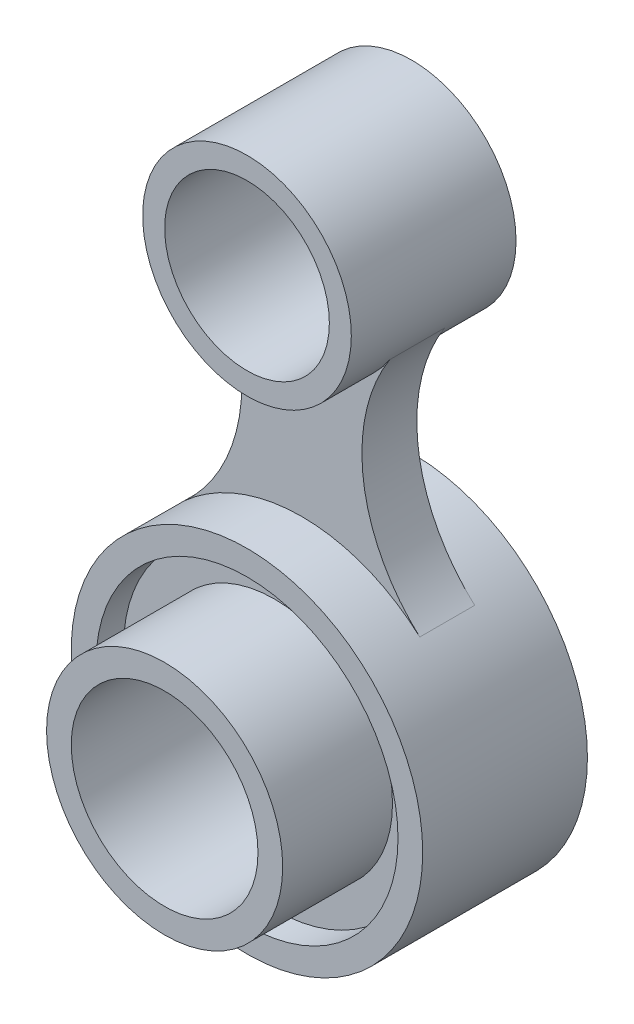
ISO-10303-21;
HEADER;
FILE_DESCRIPTION(('STEP AP214'),'2;1');
FILE_NAME('part.step','',(''),(''),'','','');
FILE_SCHEMA(('AUTOMOTIVE_DESIGN { 1 0 10303 214 1 1 1 1 }'));
ENDSEC;
DATA;
#1=APPLICATION_CONTEXT('core data for automotive mechanical design processes');
#2=APPLICATION_PROTOCOL_DEFINITION('international standard','automotive_design',2000,#1);
#3=PRODUCT_CONTEXT('',#1,'mechanical');
#4=PRODUCT('Part','Part','',(#3));
#5=PRODUCT_RELATED_PRODUCT_CATEGORY('part','',(#4));
#6=PRODUCT_DEFINITION_FORMATION('','',#4);
#7=PRODUCT_DEFINITION_CONTEXT('part definition',#1,'design');
#8=PRODUCT_DEFINITION('design','',#6,#7);
#9=PRODUCT_DEFINITION_SHAPE('','',#8);
#10=(LENGTH_UNIT() NAMED_UNIT(*) SI_UNIT(.MILLI.,.METRE.));
#11=(NAMED_UNIT(*) PLANE_ANGLE_UNIT() SI_UNIT($,.RADIAN.));
#12=(NAMED_UNIT(*) SI_UNIT($,.STERADIAN.) SOLID_ANGLE_UNIT());
#13=UNCERTAINTY_MEASURE_WITH_UNIT(LENGTH_MEASURE(1.E-05),#10,'distance_accuracy_value','');
#14=(GEOMETRIC_REPRESENTATION_CONTEXT(3) GLOBAL_UNCERTAINTY_ASSIGNED_CONTEXT((#13)) GLOBAL_UNIT_ASSIGNED_CONTEXT((#10,
#11,#12)) REPRESENTATION_CONTEXT('',''));
#15=CARTESIAN_POINT('',(0.,0.,0.));
#16=DIRECTION('',(0.,0.,1.));
#17=DIRECTION('',(1.,0.,0.));
#18=AXIS2_PLACEMENT_3D('',#15,#16,#17);
#19=CARTESIAN_POINT('',(0.,0.,45.));
#20=DIRECTION('',(0.,0.,-1.));
#21=DIRECTION('',(-1.,0.,0.));
#22=AXIS2_PLACEMENT_3D('',#19,#20,#21);
#23=CYLINDRICAL_SURFACE('',#22,32.);
#24=DIRECTION('',(0.,0.,-1.));
#25=VECTOR('',#24,1.);
#26=CARTESIAN_POINT('',(21.4645961734408,23.7333333333333,20.));
#27=LINE('',#26,#25);
#28=CARTESIAN_POINT('',(21.4645961734408,23.7333333333333,20.));
#29=VERTEX_POINT('',#28);
#30=CARTESIAN_POINT('',(21.4645961734408,23.7333333333333,10.));
#31=VERTEX_POINT('',#30);
#32=EDGE_CURVE('E51',#29,#31,#27,.T.);
#33=ORIENTED_EDGE('',*,*,#32,.F.);
#34=CARTESIAN_POINT('',(0.,0.,20.));
#35=DIRECTION('',(0.,0.,-1.));
#36=DIRECTION('',(1.,0.,0.));
#37=AXIS2_PLACEMENT_3D('',#34,#35,#36);
#38=CIRCLE('',#37,32.);
#39=CARTESIAN_POINT('',(-21.4645961734408,23.7333333333333,20.));
#40=VERTEX_POINT('',#39);
#41=EDGE_CURVE('E56',#40,#29,#38,.T.);
#42=ORIENTED_EDGE('',*,*,#41,.F.);
#43=DIRECTION('',(0.,0.,-1.));
#44=VECTOR('',#43,1.);
#45=CARTESIAN_POINT('',(-21.4645961734408,23.7333333333333,20.));
#46=LINE('',#45,#44);
#47=CARTESIAN_POINT('',(-21.4645961734408,23.7333333333333,10.));
#48=VERTEX_POINT('',#47);
#49=EDGE_CURVE('E96',#40,#48,#46,.T.);
#50=ORIENTED_EDGE('',*,*,#49,.T.);
#51=CARTESIAN_POINT('',(0.,0.,10.));
#52=DIRECTION('',(0.,0.,-1.));
#53=DIRECTION('',(1.,0.,0.));
#54=AXIS2_PLACEMENT_3D('',#51,#52,#53);
#55=CIRCLE('',#54,32.);
#56=EDGE_CURVE('E84',#48,#31,#55,.T.);
#57=ORIENTED_EDGE('',*,*,#56,.T.);
#58=EDGE_LOOP('',(#33,#42,#50,#57));
#59=FACE_BOUND('',#58,.T.);
#60=CARTESIAN_POINT('',(0.,0.,0.));
#61=DIRECTION('',(0.,0.,1.));
#62=DIRECTION('',(1.,0.,0.));
#63=AXIS2_PLACEMENT_3D('',#60,#61,#62);
#64=CIRCLE('',#63,32.);
#65=CARTESIAN_POINT('',(32.,0.,0.));
#66=VERTEX_POINT('',#65);
#67=EDGE_CURVE('E11',#66,#66,#64,.T.);
#68=ORIENTED_EDGE('',*,*,#67,.T.);
#69=EDGE_LOOP('',(#68));
#70=FACE_BOUND('',#69,.T.);
#71=CARTESIAN_POINT('',(0.,0.,30.));
#72=DIRECTION('',(0.,0.,1.));
#73=DIRECTION('',(1.,0.,0.));
#74=AXIS2_PLACEMENT_3D('',#71,#72,#73);
#75=CIRCLE('',#74,32.);
#76=CARTESIAN_POINT('',(32.,0.,30.));
#77=VERTEX_POINT('',#76);
#78=EDGE_CURVE('E121',#77,#77,#75,.T.);
#79=ORIENTED_EDGE('',*,*,#78,.F.);
#80=EDGE_LOOP('',(#79));
#81=FACE_BOUND('',#80,.T.);
#82=ADVANCED_FACE('F37',(#59,#70,#81),#23,.T.);
#83=CARTESIAN_POINT('',(0.,0.,45.));
#84=DIRECTION('',(0.,0.,1.));
#85=DIRECTION('',(1.,0.,0.));
#86=AXIS2_PLACEMENT_3D('',#83,#84,#85);
#87=PLANE('',#86);
#88=CARTESIAN_POINT('',(0.,0.,45.));
#89=DIRECTION('',(0.,0.,1.));
#90=DIRECTION('',(1.,0.,0.));
#91=AXIS2_PLACEMENT_3D('',#88,#89,#90);
#92=CIRCLE('',#91,17.);
#93=CARTESIAN_POINT('',(17.,0.,45.));
#94=VERTEX_POINT('',#93);
#95=EDGE_CURVE('E124',#94,#94,#92,.T.);
#96=ORIENTED_EDGE('',*,*,#95,.F.);
#97=EDGE_LOOP('',(#96));
#98=FACE_BOUND('',#97,.T.);
#99=CARTESIAN_POINT('',(0.,0.,45.));
#100=DIRECTION('',(0.,0.,1.));
#101=DIRECTION('',(1.,0.,0.));
#102=AXIS2_PLACEMENT_3D('',#99,#100,#101);
#103=CIRCLE('',#102,21.5);
#104=CARTESIAN_POINT('',(21.5,0.,45.));
#105=VERTEX_POINT('',#104);
#106=EDGE_CURVE('E116',#105,#105,#103,.T.);
#107=ORIENTED_EDGE('',*,*,#106,.T.);
#108=EDGE_LOOP('',(#107));
#109=FACE_BOUND('',#108,.T.);
#110=ADVANCED_FACE('F131',(#98,#109),#87,.T.);
#111=CARTESIAN_POINT('',(0.,0.,0.));
#112=DIRECTION('',(0.,0.,1.));
#113=DIRECTION('',(1.,0.,0.));
#114=AXIS2_PLACEMENT_3D('',#111,#112,#113);
#115=PLANE('',#114);
#116=CARTESIAN_POINT('',(0.,0.,0.));
#117=DIRECTION('',(0.,0.,1.));
#118=DIRECTION('',(1.,0.,0.));
#119=AXIS2_PLACEMENT_3D('',#116,#117,#118);
#120=CIRCLE('',#119,17.);
#121=CARTESIAN_POINT('',(17.,0.,0.));
#122=VERTEX_POINT('',#121);
#123=EDGE_CURVE('E44',#122,#122,#120,.T.);
#124=ORIENTED_EDGE('',*,*,#123,.T.);
#125=EDGE_LOOP('',(#124));
#126=FACE_BOUND('',#125,.T.);
#127=ORIENTED_EDGE('',*,*,#67,.F.);
#128=EDGE_LOOP('',(#127));
#129=FACE_BOUND('',#128,.T.);
#130=ADVANCED_FACE('F134',(#126,#129),#115,.F.);
#131=CARTESIAN_POINT('',(0.,0.,0.));
#132=DIRECTION('',(0.,0.,1.));
#133=DIRECTION('',(1.,0.,0.));
#134=AXIS2_PLACEMENT_3D('',#131,#132,#133);
#135=CYLINDRICAL_SURFACE('',#134,17.);
#136=CARTESIAN_POINT('',(17.,0.,0.));
#137=CARTESIAN_POINT('',(17.,0.,0.468749999999999));
#138=CARTESIAN_POINT('',(17.,0.,0.9375));
#139=CARTESIAN_POINT('',(17.,0.,1.875));
#140=CARTESIAN_POINT('',(17.,0.,2.34375));
#141=CARTESIAN_POINT('',(17.,0.,3.28125));
#142=CARTESIAN_POINT('',(17.,0.,3.75));
#143=CARTESIAN_POINT('',(17.,0.,4.6875));
#144=CARTESIAN_POINT('',(17.,0.,5.15625));
#145=CARTESIAN_POINT('',(17.,0.,6.09375));
#146=CARTESIAN_POINT('',(17.,0.,6.5625));
#147=CARTESIAN_POINT('',(17.,0.,7.5));
#148=CARTESIAN_POINT('',(17.,0.,7.96875));
#149=CARTESIAN_POINT('',(17.,0.,8.90625));
#150=CARTESIAN_POINT('',(17.,0.,9.375));
#151=CARTESIAN_POINT('',(17.,0.,10.3125));
#152=CARTESIAN_POINT('',(17.,0.,10.78125));
#153=CARTESIAN_POINT('',(17.,0.,11.71875));
#154=CARTESIAN_POINT('',(17.,0.,12.1875));
#155=CARTESIAN_POINT('',(17.,0.,13.125));
#156=CARTESIAN_POINT('',(17.,0.,13.59375));
#157=CARTESIAN_POINT('',(17.,0.,14.53125));
#158=CARTESIAN_POINT('',(17.,0.,15.));
#159=CARTESIAN_POINT('',(17.,0.,15.9375));
#160=CARTESIAN_POINT('',(17.,0.,16.40625));
#161=CARTESIAN_POINT('',(17.,0.,17.34375));
#162=CARTESIAN_POINT('',(17.,0.,17.8125));
#163=CARTESIAN_POINT('',(17.,0.,18.75));
#164=CARTESIAN_POINT('',(17.,0.,19.21875));
#165=CARTESIAN_POINT('',(17.,0.,20.15625));
#166=CARTESIAN_POINT('',(17.,0.,20.625));
#167=CARTESIAN_POINT('',(17.,0.,21.5625));
#168=CARTESIAN_POINT('',(17.,0.,22.03125));
#169=CARTESIAN_POINT('',(17.,0.,22.96875));
#170=CARTESIAN_POINT('',(17.,0.,23.4375));
#171=CARTESIAN_POINT('',(17.,0.,24.375));
#172=CARTESIAN_POINT('',(17.,0.,24.84375));
#173=CARTESIAN_POINT('',(17.,0.,25.78125));
#174=CARTESIAN_POINT('',(17.,0.,26.25));
#175=CARTESIAN_POINT('',(17.,0.,27.1875));
#176=CARTESIAN_POINT('',(17.,0.,27.65625));
#177=CARTESIAN_POINT('',(17.,0.,28.59375));
#178=CARTESIAN_POINT('',(17.,0.,29.0625));
#179=CARTESIAN_POINT('',(17.,0.,30.));
#180=CARTESIAN_POINT('',(17.,0.,30.46875));
#181=CARTESIAN_POINT('',(17.,0.,31.40625));
#182=CARTESIAN_POINT('',(17.,0.,31.875));
#183=CARTESIAN_POINT('',(17.,0.,32.8125));
#184=CARTESIAN_POINT('',(17.,0.,33.28125));
#185=CARTESIAN_POINT('',(17.,0.,34.21875));
#186=CARTESIAN_POINT('',(17.,0.,34.6875));
#187=CARTESIAN_POINT('',(17.,0.,35.625));
#188=CARTESIAN_POINT('',(17.,0.,36.09375));
#189=CARTESIAN_POINT('',(17.,0.,37.03125));
#190=CARTESIAN_POINT('',(17.,0.,37.5));
#191=CARTESIAN_POINT('',(17.,0.,38.4375));
#192=CARTESIAN_POINT('',(17.,0.,38.90625));
#193=CARTESIAN_POINT('',(17.,0.,39.84375));
#194=CARTESIAN_POINT('',(17.,0.,40.3125));
#195=CARTESIAN_POINT('',(17.,0.,41.25));
#196=CARTESIAN_POINT('',(17.,0.,41.71875));
#197=CARTESIAN_POINT('',(17.,0.,42.65625));
#198=CARTESIAN_POINT('',(17.,0.,43.125));
#199=CARTESIAN_POINT('',(17.,0.,44.0625));
#200=CARTESIAN_POINT('',(17.,0.,44.53125));
#201=CARTESIAN_POINT('',(17.,0.,45.));
#202=B_SPLINE_CURVE_WITH_KNOTS('',3,(#136,#137,#138,#139,#140,#141,#142,#143,#144,#145,#146,
#147,#148,#149,#150,#151,#152,#153,#154,#155,#156,#157,#158,#159,#160,#161,#162,#163,#164,#165,
#166,#167,#168,#169,#170,#171,#172,#173,#174,#175,#176,#177,#178,#179,#180,#181,#182,#183,#184,
#185,#186,#187,#188,#189,#190,#191,#192,#193,#194,#195,#196,#197,#198,#199,#200,#201),
.UNSPECIFIED.,.F.,.F.,(4,2,2,2,2,2,2,2,2,2,2,2,2,2,2,2,2,2,2,2,2,2,2,2,2,2,2,2,2,2,2,2,4),(0.,
1.40625,2.8125,4.21875,5.625,7.03125,8.4375,9.84375,11.25,12.65625,14.0625,15.46875,16.875,
18.28125,19.6875,21.09375,22.5,23.90625,25.3125,26.71875,28.125,29.53125,30.9375,32.34375,33.75,
35.15625,36.5625,37.96875,39.375,40.78125,42.1875,43.59375,45.),.UNSPECIFIED.);
#203=EDGE_CURVE('BSEAM129',#122,#94,#202,.T.);
#204=ORIENTED_EDGE('',*,*,#123,.F.);
#205=ORIENTED_EDGE('',*,*,#95,.T.);
#206=ORIENTED_EDGE('',*,*,#203,.T.);
#207=ORIENTED_EDGE('',*,*,#203,.F.);
#208=EDGE_LOOP('',(#204,#206,#205,#207));
#209=FACE_BOUND('',#208,.T.);
#210=ADVANCED_FACE('F129',(#209),#135,.F.);
#211=CARTESIAN_POINT('',(0.,0.,30.));
#212=DIRECTION('',(0.,0.,1.));
#213=DIRECTION('',(1.,0.,0.));
#214=AXIS2_PLACEMENT_3D('',#211,#212,#213);
#215=PLANE('',#214);
#216=CARTESIAN_POINT('',(0.,0.,30.));
#217=DIRECTION('',(0.,0.,1.));
#218=DIRECTION('',(1.,0.,0.));
#219=AXIS2_PLACEMENT_3D('',#216,#217,#218);
#220=CIRCLE('',#219,27.5);
#221=CARTESIAN_POINT('',(27.5,0.,30.));
#222=VERTEX_POINT('',#221);
#223=EDGE_CURVE('E112',#222,#222,#220,.T.);
#224=ORIENTED_EDGE('',*,*,#223,.F.);
#225=EDGE_LOOP('',(#224));
#226=FACE_BOUND('',#225,.T.);
#227=ORIENTED_EDGE('',*,*,#78,.T.);
#228=EDGE_LOOP('',(#227));
#229=FACE_BOUND('',#228,.T.);
#230=ADVANCED_FACE('F142',(#226,#229),#215,.T.);
#231=CARTESIAN_POINT('',(0.,0.,30.));
#232=DIRECTION('',(0.,0.,1.));
#233=DIRECTION('',(1.,0.,0.));
#234=AXIS2_PLACEMENT_3D('',#231,#232,#233);
#235=CYLINDRICAL_SURFACE('',#234,21.5);
#236=ORIENTED_EDGE('',*,*,#106,.F.);
#237=EDGE_LOOP('',(#236));
#238=FACE_BOUND('',#237,.T.);
#239=CARTESIAN_POINT('',(0.,0.,25.));
#240=DIRECTION('',(0.,0.,1.));
#241=DIRECTION('',(1.,0.,0.));
#242=AXIS2_PLACEMENT_3D('',#239,#240,#241);
#243=CIRCLE('',#242,21.5);
#244=CARTESIAN_POINT('',(21.5,0.,25.));
#245=VERTEX_POINT('',#244);
#246=EDGE_CURVE('E109',#245,#245,#243,.T.);
#247=ORIENTED_EDGE('',*,*,#246,.T.);
#248=EDGE_LOOP('',(#247));
#249=FACE_BOUND('',#248,.T.);
#250=ADVANCED_FACE('F138',(#238,#249),#235,.T.);
#251=CARTESIAN_POINT('',(0.,0.,25.));
#252=DIRECTION('',(0.,0.,1.));
#253=DIRECTION('',(1.,0.,0.));
#254=AXIS2_PLACEMENT_3D('',#251,#252,#253);
#255=CYLINDRICAL_SURFACE('',#254,27.5);
#256=CARTESIAN_POINT('',(0.,0.,25.));
#257=DIRECTION('',(0.,0.,1.));
#258=DIRECTION('',(1.,0.,0.));
#259=AXIS2_PLACEMENT_3D('',#256,#257,#258);
#260=CIRCLE('',#259,27.5);
#261=CARTESIAN_POINT('',(27.5,0.,25.));
#262=VERTEX_POINT('',#261);
#263=EDGE_CURVE('E113',#262,#262,#260,.T.);
#264=ORIENTED_EDGE('',*,*,#263,.F.);
#265=EDGE_LOOP('',(#264));
#266=FACE_BOUND('',#265,.T.);
#267=ORIENTED_EDGE('',*,*,#223,.T.);
#268=EDGE_LOOP('',(#267));
#269=FACE_BOUND('',#268,.T.);
#270=ADVANCED_FACE('F141',(#266,#269),#255,.F.);
#271=CARTESIAN_POINT('',(0.,0.,25.));
#272=DIRECTION('',(0.,0.,1.));
#273=DIRECTION('',(1.,0.,0.));
#274=AXIS2_PLACEMENT_3D('',#271,#272,#273);
#275=PLANE('',#274);
#276=ORIENTED_EDGE('',*,*,#246,.F.);
#277=EDGE_LOOP('',(#276));
#278=FACE_BOUND('',#277,.T.);
#279=ORIENTED_EDGE('',*,*,#263,.T.);
#280=EDGE_LOOP('',(#279));
#281=FACE_BOUND('',#280,.T.);
#282=ADVANCED_FACE('F146',(#278,#281),#275,.T.);
#283=CARTESIAN_POINT('',(42.9291923468816,47.4666666666667,20.));
#284=DIRECTION('',(0.,0.,-1.));
#285=DIRECTION('',(-1.,0.,0.));
#286=AXIS2_PLACEMENT_3D('',#283,#284,#285);
#287=CYLINDRICAL_SURFACE('',#286,32.);
#288=CARTESIAN_POINT('',(42.9291923468816,47.4666666666667,10.));
#289=DIRECTION('',(0.,0.,-1.));
#290=DIRECTION('',(1.,0.,0.));
#291=AXIS2_PLACEMENT_3D('',#288,#289,#290);
#292=CIRCLE('',#291,32.);
#293=CARTESIAN_POINT('',(15.9932285213872,64.7424836601307,10.));
#294=VERTEX_POINT('',#293);
#295=EDGE_CURVE('E101',#31,#294,#292,.T.);
#296=ORIENTED_EDGE('',*,*,#295,.T.);
#297=DIRECTION('',(0.,0.,-1.));
#298=VECTOR('',#297,1.);
#299=CARTESIAN_POINT('',(15.9932285213872,64.7424836601307,20.));
#300=LINE('',#299,#298);
#301=CARTESIAN_POINT('',(15.9932285213872,64.7424836601307,20.));
#302=VERTEX_POINT('',#301);
#303=EDGE_CURVE('E95',#302,#294,#300,.T.);
#304=ORIENTED_EDGE('',*,*,#303,.F.);
#305=CARTESIAN_POINT('',(42.9291923468816,47.4666666666667,20.));
#306=DIRECTION('',(0.,0.,-1.));
#307=DIRECTION('',(1.,0.,0.));
#308=AXIS2_PLACEMENT_3D('',#305,#306,#307);
#309=CIRCLE('',#308,32.);
#310=EDGE_CURVE('E221',#29,#302,#309,.T.);
#311=ORIENTED_EDGE('',*,*,#310,.F.);
#312=ORIENTED_EDGE('',*,*,#32,.T.);
#313=EDGE_LOOP('',(#296,#304,#311,#312));
#314=FACE_BOUND('',#313,.T.);
#315=ADVANCED_FACE('F149',(#314),#287,.F.);
#316=CARTESIAN_POINT('',(-42.9291923468816,47.4666666666667,20.));
#317=DIRECTION('',(0.,0.,-1.));
#318=DIRECTION('',(-1.,0.,0.));
#319=AXIS2_PLACEMENT_3D('',#316,#317,#318);
#320=CYLINDRICAL_SURFACE('',#319,32.);
#321=CARTESIAN_POINT('',(-42.9291923468816,47.4666666666667,10.));
#322=DIRECTION('',(0.,0.,-1.));
#323=DIRECTION('',(-1.,0.,0.));
#324=AXIS2_PLACEMENT_3D('',#321,#322,#323);
#325=CIRCLE('',#324,32.);
#326=CARTESIAN_POINT('',(-15.9932285213873,64.7424836601307,10.));
#327=VERTEX_POINT('',#326);
#328=EDGE_CURVE('E77',#327,#48,#325,.T.);
#329=ORIENTED_EDGE('',*,*,#328,.T.);
#330=ORIENTED_EDGE('',*,*,#49,.F.);
#331=CARTESIAN_POINT('',(-42.9291923468816,47.4666666666667,20.));
#332=DIRECTION('',(0.,0.,-1.));
#333=DIRECTION('',(-1.,0.,0.));
#334=AXIS2_PLACEMENT_3D('',#331,#332,#333);
#335=CIRCLE('',#334,32.);
#336=CARTESIAN_POINT('',(-15.9932285213873,64.7424836601307,20.));
#337=VERTEX_POINT('',#336);
#338=EDGE_CURVE('E92',#337,#40,#335,.T.);
#339=ORIENTED_EDGE('',*,*,#338,.F.);
#340=DIRECTION('',(0.,0.,-1.));
#341=VECTOR('',#340,1.);
#342=CARTESIAN_POINT('',(-15.9932285213873,64.7424836601307,20.));
#343=LINE('',#342,#341);
#344=EDGE_CURVE('E90',#337,#327,#343,.T.);
#345=ORIENTED_EDGE('',*,*,#344,.T.);
#346=EDGE_LOOP('',(#329,#330,#339,#345));
#347=FACE_BOUND('',#346,.T.);
#348=ADVANCED_FACE('F91',(#347),#320,.F.);
#349=CARTESIAN_POINT('',(-21.4645961734408,23.7333333333333,20.));
#350=DIRECTION('',(0.,0.,1.));
#351=DIRECTION('',(1.,0.,0.));
#352=AXIS2_PLACEMENT_3D('',#349,#350,#351);
#353=PLANE('',#352);
#354=ORIENTED_EDGE('',*,*,#41,.T.);
#355=ORIENTED_EDGE('',*,*,#310,.T.);
#356=CARTESIAN_POINT('',(0.,75.,20.));
#357=DIRECTION('',(0.,0.,-1.));
#358=DIRECTION('',(1.,0.,0.));
#359=AXIS2_PLACEMENT_3D('',#356,#357,#358);
#360=CIRCLE('',#359,19.);
#361=EDGE_CURVE('E223',#302,#337,#360,.T.);
#362=ORIENTED_EDGE('',*,*,#361,.T.);
#363=ORIENTED_EDGE('',*,*,#338,.T.);
#364=EDGE_LOOP('',(#354,#355,#362,#363));
#365=FACE_BOUND('',#364,.T.);
#366=ADVANCED_FACE('F182',(#365),#353,.T.);
#367=CARTESIAN_POINT('',(-21.4645961734408,23.7333333333333,10.));
#368=DIRECTION('',(0.,0.,1.));
#369=DIRECTION('',(1.,0.,0.));
#370=AXIS2_PLACEMENT_3D('',#367,#368,#369);
#371=PLANE('',#370);
#372=ORIENTED_EDGE('',*,*,#56,.F.);
#373=ORIENTED_EDGE('',*,*,#328,.F.);
#374=CARTESIAN_POINT('',(0.,75.,10.));
#375=DIRECTION('',(0.,0.,-1.));
#376=DIRECTION('',(1.,0.,0.));
#377=AXIS2_PLACEMENT_3D('',#374,#375,#376);
#378=CIRCLE('',#377,19.);
#379=EDGE_CURVE('E82',#294,#327,#378,.T.);
#380=ORIENTED_EDGE('',*,*,#379,.F.);
#381=ORIENTED_EDGE('',*,*,#295,.F.);
#382=EDGE_LOOP('',(#372,#373,#380,#381));
#383=FACE_BOUND('',#382,.T.);
#384=ADVANCED_FACE('F79',(#383),#371,.F.);
#385=CARTESIAN_POINT('',(0.,75.,30.));
#386=DIRECTION('',(0.,0.,1.));
#387=DIRECTION('',(1.,0.,0.));
#388=AXIS2_PLACEMENT_3D('',#385,#386,#387);
#389=PLANE('',#388);
#390=CARTESIAN_POINT('',(0.,75.,30.));
#391=DIRECTION('',(0.,0.,1.));
#392=DIRECTION('',(1.,0.,0.));
#393=AXIS2_PLACEMENT_3D('',#390,#391,#392);
#394=CIRCLE('',#393,19.);
#395=CARTESIAN_POINT('',(19.,75.,30.));
#396=VERTEX_POINT('',#395);
#397=EDGE_CURVE('E215',#396,#396,#394,.T.);
#398=ORIENTED_EDGE('',*,*,#397,.T.);
#399=EDGE_LOOP('',(#398));
#400=FACE_BOUND('',#399,.T.);
#401=CARTESIAN_POINT('',(0.,75.,30.));
#402=DIRECTION('',(0.,0.,1.));
#403=DIRECTION('',(1.,0.,0.));
#404=AXIS2_PLACEMENT_3D('',#401,#402,#403);
#405=CIRCLE('',#404,15.);
#406=CARTESIAN_POINT('',(15.,75.,30.));
#407=VERTEX_POINT('',#406);
#408=EDGE_CURVE('E206',#407,#407,#405,.T.);
#409=ORIENTED_EDGE('',*,*,#408,.F.);
#410=EDGE_LOOP('',(#409));
#411=FACE_BOUND('',#410,.T.);
#412=ADVANCED_FACE('F185',(#400,#411),#389,.T.);
#413=CARTESIAN_POINT('',(0.,75.,0.));
#414=DIRECTION('',(0.,0.,1.));
#415=DIRECTION('',(1.,0.,0.));
#416=AXIS2_PLACEMENT_3D('',#413,#414,#415);
#417=PLANE('',#416);
#418=CARTESIAN_POINT('',(0.,75.,0.));
#419=DIRECTION('',(0.,0.,1.));
#420=DIRECTION('',(1.,0.,0.));
#421=AXIS2_PLACEMENT_3D('',#418,#419,#420);
#422=CIRCLE('',#421,19.);
#423=CARTESIAN_POINT('',(19.,75.,0.));
#424=VERTEX_POINT('',#423);
#425=EDGE_CURVE('E212',#424,#424,#422,.T.);
#426=ORIENTED_EDGE('',*,*,#425,.F.);
#427=EDGE_LOOP('',(#426));
#428=FACE_BOUND('',#427,.T.);
#429=CARTESIAN_POINT('',(0.,75.,0.));
#430=DIRECTION('',(0.,0.,1.));
#431=DIRECTION('',(1.,0.,0.));
#432=AXIS2_PLACEMENT_3D('',#429,#430,#431);
#433=CIRCLE('',#432,15.);
#434=CARTESIAN_POINT('',(15.,75.,0.));
#435=VERTEX_POINT('',#434);
#436=EDGE_CURVE('E209',#435,#435,#433,.T.);
#437=ORIENTED_EDGE('',*,*,#436,.T.);
#438=EDGE_LOOP('',(#437));
#439=FACE_BOUND('',#438,.T.);
#440=ADVANCED_FACE('F192',(#428,#439),#417,.F.);
#441=CARTESIAN_POINT('',(0.,75.,30.));
#442=DIRECTION('',(0.,0.,-1.));
#443=DIRECTION('',(-1.,0.,0.));
#444=AXIS2_PLACEMENT_3D('',#441,#442,#443);
#445=CYLINDRICAL_SURFACE('',#444,19.);
#446=ORIENTED_EDGE('',*,*,#361,.F.);
#447=ORIENTED_EDGE('',*,*,#303,.T.);
#448=ORIENTED_EDGE('',*,*,#379,.T.);
#449=ORIENTED_EDGE('',*,*,#344,.F.);
#450=EDGE_LOOP('',(#446,#447,#448,#449));
#451=FACE_BOUND('',#450,.T.);
#452=ORIENTED_EDGE('',*,*,#397,.F.);
#453=EDGE_LOOP('',(#452));
#454=FACE_BOUND('',#453,.T.);
#455=ORIENTED_EDGE('',*,*,#425,.T.);
#456=EDGE_LOOP('',(#455));
#457=FACE_BOUND('',#456,.T.);
#458=ADVANCED_FACE('F98',(#451,#454,#457),#445,.T.);
#459=CARTESIAN_POINT('',(0.,75.,30.));
#460=DIRECTION('',(0.,0.,-1.));
#461=DIRECTION('',(-1.,0.,0.));
#462=AXIS2_PLACEMENT_3D('',#459,#460,#461);
#463=CYLINDRICAL_SURFACE('',#462,15.);
#464=ORIENTED_EDGE('',*,*,#408,.T.);
#465=EDGE_LOOP('',(#464));
#466=FACE_BOUND('',#465,.T.);
#467=ORIENTED_EDGE('',*,*,#436,.F.);
#468=EDGE_LOOP('',(#467));
#469=FACE_BOUND('',#468,.T.);
#470=ADVANCED_FACE('F191',(#466,#469),#463,.F.);
#471=CLOSED_SHELL('',(#82,#110,#130,#210,#230,#250,#270,#282,#315,#348,#366,#384,#412,#440,#458,#470));
#472=MANIFOLD_SOLID_BREP('B2',#471);
#473=ADVANCED_BREP_SHAPE_REPRESENTATION('',(#18,#472),#14);
#474=SHAPE_DEFINITION_REPRESENTATION(#9,#473);
ENDSEC;
END-ISO-10303-21;
